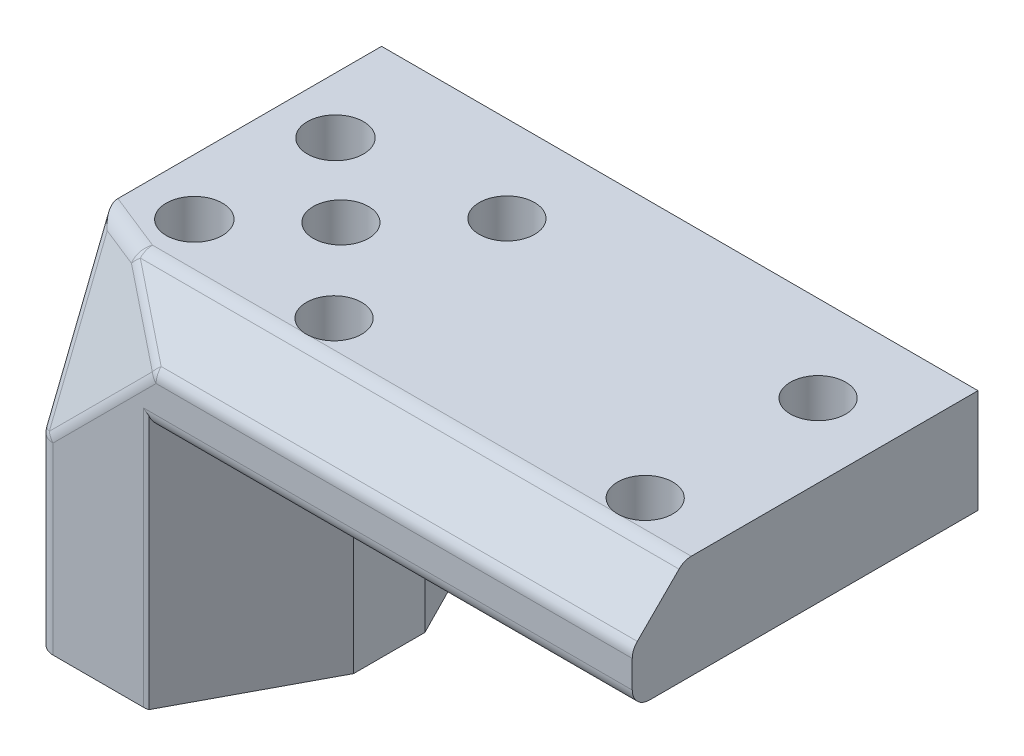
ISO-10303-21;
HEADER;
FILE_DESCRIPTION(('STEP AP214'),'2;1');
FILE_NAME('part.step','',(''),(''),'','','');
FILE_SCHEMA(('AUTOMOTIVE_DESIGN { 1 0 10303 214 1 1 1 1 }'));
ENDSEC;
DATA;
#1=APPLICATION_CONTEXT('core data for automotive mechanical design processes');
#2=APPLICATION_PROTOCOL_DEFINITION('international standard','automotive_design',2000,#1);
#3=PRODUCT_CONTEXT('',#1,'mechanical');
#4=PRODUCT('Part','Part','',(#3));
#5=PRODUCT_RELATED_PRODUCT_CATEGORY('part','',(#4));
#6=PRODUCT_DEFINITION_FORMATION('','',#4);
#7=PRODUCT_DEFINITION_CONTEXT('part definition',#1,'design');
#8=PRODUCT_DEFINITION('design','',#6,#7);
#9=PRODUCT_DEFINITION_SHAPE('','',#8);
#10=(LENGTH_UNIT() NAMED_UNIT(*) SI_UNIT(.MILLI.,.METRE.));
#11=(NAMED_UNIT(*) PLANE_ANGLE_UNIT() SI_UNIT($,.RADIAN.));
#12=(NAMED_UNIT(*) SI_UNIT($,.STERADIAN.) SOLID_ANGLE_UNIT());
#13=UNCERTAINTY_MEASURE_WITH_UNIT(LENGTH_MEASURE(1.E-05),#10,'distance_accuracy_value','');
#14=(GEOMETRIC_REPRESENTATION_CONTEXT(3) GLOBAL_UNCERTAINTY_ASSIGNED_CONTEXT((#13)) GLOBAL_UNIT_ASSIGNED_CONTEXT((#10,
#11,#12)) REPRESENTATION_CONTEXT('',''));
#15=CARTESIAN_POINT('',(0.,0.,0.));
#16=DIRECTION('',(0.,0.,1.));
#17=DIRECTION('',(1.,0.,0.));
#18=AXIS2_PLACEMENT_3D('',#15,#16,#17);
#19=CARTESIAN_POINT('',(0.,20.,0.));
#20=DIRECTION('',(0.,1.,0.));
#21=DIRECTION('',(0.,0.,1.));
#22=AXIS2_PLACEMENT_3D('',#19,#20,#21);
#23=PLANE('',#22);
#24=CARTESIAN_POINT('',(4.39754633131114,20.,0.));
#25=DIRECTION('',(0.,1.,0.));
#26=DIRECTION('',(0.,0.,1.));
#27=AXIS2_PLACEMENT_3D('',#24,#25,#26);
#28=CIRCLE('',#27,1.6);
#29=CARTESIAN_POINT('',(4.39754633131114,20.,1.59999999999997));
#30=VERTEX_POINT('',#29);
#31=EDGE_CURVE('E195',#30,#30,#28,.T.);
#32=ORIENTED_EDGE('',*,*,#31,.F.);
#33=EDGE_LOOP('',(#32));
#34=FACE_BOUND('',#33,.T.);
#35=CARTESIAN_POINT('',(27.,20.,-5.));
#36=DIRECTION('',(0.,1.,0.));
#37=DIRECTION('',(0.,0.,1.));
#38=AXIS2_PLACEMENT_3D('',#35,#36,#37);
#39=CIRCLE('',#38,1.60000000000001);
#40=CARTESIAN_POINT('',(27.,20.,-3.39999999999999));
#41=VERTEX_POINT('',#40);
#42=EDGE_CURVE('E203',#41,#41,#39,.T.);
#43=ORIENTED_EDGE('',*,*,#42,.F.);
#44=EDGE_LOOP('',(#43));
#45=FACE_BOUND('',#44,.T.);
#46=DIRECTION('',(0.,0.,1.));
#47=VECTOR('',#46,1.);
#48=CARTESIAN_POINT('',(-3.25,20.,-9.99999999999999));
#49=LINE('',#48,#47);
#50=CARTESIAN_POINT('',(-3.25,20.,-9.99999999999999));
#51=VERTEX_POINT('',#50);
#52=CARTESIAN_POINT('',(-3.24999999999999,20.,5.25108747069241));
#53=VERTEX_POINT('',#52);
#54=EDGE_CURVE('E241',#51,#53,#49,.T.);
#55=ORIENTED_EDGE('',*,*,#54,.T.);
#56=DIRECTION('',(0.928476690885259,0.,0.371390676354104));
#57=VECTOR('',#56,1.);
#58=CARTESIAN_POINT('',(-2.25899567954911,20.,5.64748919887276));
#59=LINE('',#58,#57);
#60=CARTESIAN_POINT('',(0.0867474173362875,20.,6.58578643762692));
#61=VERTEX_POINT('',#60);
#62=EDGE_CURVE('E320',#53,#61,#59,.T.);
#63=ORIENTED_EDGE('',*,*,#62,.T.);
#64=DIRECTION('',(1.,0.,0.));
#65=VECTOR('',#64,1.);
#66=CARTESIAN_POINT('',(0.,20.,6.58578643762692));
#67=LINE('',#66,#65);
#68=CARTESIAN_POINT('',(8.78720579369134,20.,6.58578643762692));
#69=VERTEX_POINT('',#68);
#70=EDGE_CURVE('E318',#61,#69,#67,.T.);
#71=ORIENTED_EDGE('',*,*,#70,.T.);
#72=CARTESIAN_POINT('',(9.,20.,5.));
#73=DIRECTION('',(0.,1.,0.));
#74=DIRECTION('',(0.,0.,1.));
#75=AXIS2_PLACEMENT_3D('',#72,#73,#74);
#76=CIRCLE('',#75,1.6);
#77=CARTESIAN_POINT('',(9.21279420630865,20.,6.58578643762692));
#78=VERTEX_POINT('',#77);
#79=EDGE_CURVE('E202',#78,#69,#76,.T.);
#80=ORIENTED_EDGE('',*,*,#79,.F.);
#81=DIRECTION('',(1.,0.,0.));
#82=VECTOR('',#81,1.);
#83=CARTESIAN_POINT('',(0.,20.,6.58578643762692));
#84=LINE('',#83,#82);
#85=CARTESIAN_POINT('',(26.7872057936913,20.,6.58578643762692));
#86=VERTEX_POINT('',#85);
#87=EDGE_CURVE('E316',#78,#86,#84,.T.);
#88=ORIENTED_EDGE('',*,*,#87,.T.);
#89=CARTESIAN_POINT('',(27.,20.,5.));
#90=DIRECTION('',(0.,1.,0.));
#91=DIRECTION('',(0.,0.,1.));
#92=AXIS2_PLACEMENT_3D('',#89,#90,#91);
#93=CIRCLE('',#92,1.60000000000001);
#94=CARTESIAN_POINT('',(27.2127942063087,20.,6.58578643762692));
#95=VERTEX_POINT('',#94);
#96=EDGE_CURVE('E199',#95,#86,#93,.T.);
#97=ORIENTED_EDGE('',*,*,#96,.F.);
#98=DIRECTION('',(1.,0.,0.));
#99=VECTOR('',#98,1.);
#100=CARTESIAN_POINT('',(0.,20.,6.58578643762692));
#101=LINE('',#100,#99);
#102=CARTESIAN_POINT('',(31.25,20.,6.58578643762692));
#103=VERTEX_POINT('',#102);
#104=EDGE_CURVE('E314',#95,#103,#101,.T.);
#105=ORIENTED_EDGE('',*,*,#104,.T.);
#106=DIRECTION('',(0.,0.,1.));
#107=VECTOR('',#106,1.);
#108=CARTESIAN_POINT('',(31.25,20.,10.));
#109=LINE('',#108,#107);
#110=CARTESIAN_POINT('',(31.25,20.,-9.99999999999999));
#111=VERTEX_POINT('',#110);
#112=EDGE_CURVE('E221',#111,#103,#109,.T.);
#113=ORIENTED_EDGE('',*,*,#112,.F.);
#114=DIRECTION('',(-1.,0.,0.));
#115=VECTOR('',#114,1.);
#116=CARTESIAN_POINT('',(-3.25,20.,-9.99999999999999));
#117=LINE('',#116,#115);
#118=EDGE_CURVE('E239',#111,#51,#117,.T.);
#119=ORIENTED_EDGE('',*,*,#118,.T.);
#120=EDGE_LOOP('',(#55,#63,#71,#80,#88,#97,#105,#113,#119));
#121=FACE_BOUND('',#120,.T.);
#122=CARTESIAN_POINT('',(8.99999999999999,20.,-5.));
#123=DIRECTION('',(0.,1.,0.));
#124=DIRECTION('',(0.,0.,1.));
#125=AXIS2_PLACEMENT_3D('',#122,#123,#124);
#126=CIRCLE('',#125,1.6);
#127=CARTESIAN_POINT('',(8.99999999999999,20.,-3.4));
#128=VERTEX_POINT('',#127);
#129=EDGE_CURVE('E206',#128,#128,#126,.T.);
#130=ORIENTED_EDGE('',*,*,#129,.F.);
#131=EDGE_LOOP('',(#130));
#132=FACE_BOUND('',#131,.T.);
#133=CARTESIAN_POINT('',(0.,20.,-4.08186063750002));
#134=DIRECTION('',(0.,1.,0.));
#135=DIRECTION('',(0.,0.,1.));
#136=AXIS2_PLACEMENT_3D('',#133,#134,#135);
#137=CIRCLE('',#136,1.625);
#138=CARTESIAN_POINT('',(0.,20.,-2.45686063750001));
#139=VERTEX_POINT('',#138);
#140=EDGE_CURVE('E228',#139,#139,#137,.T.);
#141=ORIENTED_EDGE('',*,*,#140,.F.);
#142=EDGE_LOOP('',(#141));
#143=FACE_BOUND('',#142,.T.);
#144=CARTESIAN_POINT('',(0.,20.,4.08186063750001));
#145=DIRECTION('',(0.,1.,0.));
#146=DIRECTION('',(0.,0.,1.));
#147=AXIS2_PLACEMENT_3D('',#144,#145,#146);
#148=CIRCLE('',#147,1.625);
#149=CARTESIAN_POINT('',(0.,20.,5.70686063750001));
#150=VERTEX_POINT('',#149);
#151=EDGE_CURVE('E234',#150,#150,#148,.T.);
#152=ORIENTED_EDGE('',*,*,#151,.F.);
#153=EDGE_LOOP('',(#152));
#154=FACE_BOUND('',#153,.T.);
#155=ADVANCED_FACE('F32',(#34,#45,#121,#132,#143,#154),#23,.T.);
#156=CARTESIAN_POINT('',(0.,0.,0.));
#157=DIRECTION('',(0.,1.,0.));
#158=DIRECTION('',(0.,0.,1.));
#159=AXIS2_PLACEMENT_3D('',#156,#157,#158);
#160=PLANE('',#159);
#161=CARTESIAN_POINT('',(0.,0.,4.08186063750001));
#162=DIRECTION('',(0.,1.,0.));
#163=DIRECTION('',(0.,0.,1.));
#164=AXIS2_PLACEMENT_3D('',#161,#162,#163);
#165=CIRCLE('',#164,1.625);
#166=CARTESIAN_POINT('',(0.,0.,5.70686063750001));
#167=VERTEX_POINT('',#166);
#168=EDGE_CURVE('E231',#167,#167,#165,.T.);
#169=ORIENTED_EDGE('',*,*,#168,.T.);
#170=EDGE_LOOP('',(#169));
#171=FACE_BOUND('',#170,.T.);
#172=CARTESIAN_POINT('',(0.,0.,-4.08186063750002));
#173=DIRECTION('',(0.,1.,0.));
#174=DIRECTION('',(0.,0.,1.));
#175=AXIS2_PLACEMENT_3D('',#172,#173,#174);
#176=CIRCLE('',#175,1.625);
#177=CARTESIAN_POINT('',(0.,0.,-2.45686063750001));
#178=VERTEX_POINT('',#177);
#179=EDGE_CURVE('E227',#178,#178,#176,.T.);
#180=ORIENTED_EDGE('',*,*,#179,.T.);
#181=EDGE_LOOP('',(#180));
#182=FACE_BOUND('',#181,.T.);
#183=DIRECTION('',(-0.470099456092972,0.,0.882613449580898));
#184=VECTOR('',#183,1.);
#185=CARTESIAN_POINT('',(7.36683500885674,0.,2.23557898195876));
#186=LINE('',#185,#184);
#187=CARTESIAN_POINT('',(7.36683500885674,0.,2.23557898195876));
#188=VERTEX_POINT('',#187);
#189=CARTESIAN_POINT('',(3.25000000000001,0.,9.9649517804753));
#190=VERTEX_POINT('',#189);
#191=EDGE_CURVE('E188',#188,#190,#186,.T.);
#192=ORIENTED_EDGE('',*,*,#191,.T.);
#193=CARTESIAN_POINT('',(2.98757275035255,0.,9.00000000000001));
#194=DIRECTION('',(0.,1.,0.));
#195=DIRECTION('',(0.,0.,1.));
#196=AXIS2_PLACEMENT_3D('',#193,#194,#195);
#197=CIRCLE('',#196,1.);
#198=CARTESIAN_POINT('',(2.98757275035255,0.,10.));
#199=VERTEX_POINT('',#198);
#200=EDGE_CURVE('E299',#190,#199,#197,.F.);
#201=ORIENTED_EDGE('',*,*,#200,.T.);
#202=DIRECTION('',(1.,0.,0.));
#203=VECTOR('',#202,1.);
#204=CARTESIAN_POINT('',(-3.24999999999999,0.,10.));
#205=LINE('',#204,#203);
#206=CARTESIAN_POINT('',(-2.24999999999999,0.,10.));
#207=VERTEX_POINT('',#206);
#208=EDGE_CURVE('E242',#207,#199,#205,.T.);
#209=ORIENTED_EDGE('',*,*,#208,.F.);
#210=CARTESIAN_POINT('',(-2.24999999999999,0.,9.00000000000001));
#211=DIRECTION('',(0.,1.,0.));
#212=DIRECTION('',(0.,0.,1.));
#213=AXIS2_PLACEMENT_3D('',#210,#211,#212);
#214=CIRCLE('',#213,1.);
#215=CARTESIAN_POINT('',(-3.24999999999999,0.,9.00000000000001));
#216=VERTEX_POINT('',#215);
#217=EDGE_CURVE('E297',#207,#216,#214,.F.);
#218=ORIENTED_EDGE('',*,*,#217,.T.);
#219=DIRECTION('',(0.,0.,1.));
#220=VECTOR('',#219,1.);
#221=CARTESIAN_POINT('',(-3.25,0.,-9.99999999999999));
#222=LINE('',#221,#220);
#223=CARTESIAN_POINT('',(-3.25,0.,-9.99999999999999));
#224=VERTEX_POINT('',#223);
#225=EDGE_CURVE('E247',#224,#216,#222,.T.);
#226=ORIENTED_EDGE('',*,*,#225,.F.);
#227=DIRECTION('',(-1.,0.,0.));
#228=VECTOR('',#227,1.);
#229=CARTESIAN_POINT('',(-3.25,0.,-9.99999999999999));
#230=LINE('',#229,#228);
#231=CARTESIAN_POINT('',(3.25,0.,-9.99999999999999));
#232=VERTEX_POINT('',#231);
#233=EDGE_CURVE('E174',#232,#224,#230,.T.);
#234=ORIENTED_EDGE('',*,*,#233,.F.);
#235=DIRECTION('',(0.452600945600763,0.,0.891713173638976));
#236=VECTOR('',#235,1.);
#237=CARTESIAN_POINT('',(3.25,0.,-9.99999999999999));
#238=LINE('',#237,#236);
#239=CARTESIAN_POINT('',(7.36683500885674,0.,-1.88902266604213));
#240=VERTEX_POINT('',#239);
#241=EDGE_CURVE('E166',#232,#240,#238,.T.);
#242=ORIENTED_EDGE('',*,*,#241,.T.);
#243=DIRECTION('',(0.,0.,1.));
#244=VECTOR('',#243,1.);
#245=CARTESIAN_POINT('',(7.36683500885674,0.,-1.88902266604213));
#246=LINE('',#245,#244);
#247=EDGE_CURVE('E171',#240,#188,#246,.T.);
#248=ORIENTED_EDGE('',*,*,#247,.T.);
#249=EDGE_LOOP('',(#192,#201,#209,#218,#226,#234,#242,#248));
#250=FACE_BOUND('',#249,.T.);
#251=CARTESIAN_POINT('',(4.39754633131114,0.,0.));
#252=DIRECTION('',(0.,1.,0.));
#253=DIRECTION('',(0.,0.,1.));
#254=AXIS2_PLACEMENT_3D('',#251,#252,#253);
#255=CIRCLE('',#254,1.6);
#256=CARTESIAN_POINT('',(4.39754633131114,0.,1.59999999999997));
#257=VERTEX_POINT('',#256);
#258=EDGE_CURVE('E178',#257,#257,#255,.F.);
#259=ORIENTED_EDGE('',*,*,#258,.F.);
#260=EDGE_LOOP('',(#259));
#261=FACE_BOUND('',#260,.T.);
#262=ADVANCED_FACE('F169',(#171,#182,#250,#261),#160,.F.);
#263=CARTESIAN_POINT('',(-3.25,20.,-9.99999999999999));
#264=DIRECTION('',(0.,0.,1.));
#265=DIRECTION('',(1.,0.,0.));
#266=AXIS2_PLACEMENT_3D('',#263,#264,#265);
#267=PLANE('',#266);
#268=DIRECTION('',(-1.,0.,0.));
#269=VECTOR('',#268,1.);
#270=CARTESIAN_POINT('',(31.25,14.,-9.99999999999999));
#271=LINE('',#270,#269);
#272=CARTESIAN_POINT('',(31.25,14.,-9.99999999999999));
#273=VERTEX_POINT('',#272);
#274=CARTESIAN_POINT('',(3.25,14.,-9.99999999999999));
#275=VERTEX_POINT('',#274);
#276=EDGE_CURVE('E224',#273,#275,#271,.T.);
#277=ORIENTED_EDGE('',*,*,#276,.T.);
#278=DIRECTION('',(0.,-1.,0.));
#279=VECTOR('',#278,1.);
#280=CARTESIAN_POINT('',(3.25,20.,-9.99999999999999));
#281=LINE('',#280,#279);
#282=EDGE_CURVE('E254',#275,#232,#281,.T.);
#283=ORIENTED_EDGE('',*,*,#282,.T.);
#284=ORIENTED_EDGE('',*,*,#233,.T.);
#285=DIRECTION('',(0.,-1.,0.));
#286=VECTOR('',#285,1.);
#287=CARTESIAN_POINT('',(-3.25,20.,-9.99999999999999));
#288=LINE('',#287,#286);
#289=EDGE_CURVE('E245',#51,#224,#288,.T.);
#290=ORIENTED_EDGE('',*,*,#289,.F.);
#291=ORIENTED_EDGE('',*,*,#118,.F.);
#292=DIRECTION('',(0.,1.,0.));
#293=VECTOR('',#292,1.);
#294=CARTESIAN_POINT('',(31.25,20.,-9.99999999999999));
#295=LINE('',#294,#293);
#296=EDGE_CURVE('E218',#273,#111,#295,.T.);
#297=ORIENTED_EDGE('',*,*,#296,.F.);
#298=EDGE_LOOP('',(#277,#283,#284,#290,#291,#297));
#299=FACE_BOUND('',#298,.T.);
#300=ADVANCED_FACE('F368',(#299),#267,.F.);
#301=CARTESIAN_POINT('',(-3.25,20.,-9.99999999999999));
#302=DIRECTION('',(1.,0.,0.));
#303=DIRECTION('',(0.,0.,-1.));
#304=AXIS2_PLACEMENT_3D('',#301,#302,#303);
#305=PLANE('',#304);
#306=ORIENTED_EDGE('',*,*,#225,.T.);
#307=DIRECTION('',(0.,-1.,0.));
#308=VECTOR('',#307,1.);
#309=CARTESIAN_POINT('',(-3.24999999999999,20.,9.00000000000001));
#310=LINE('',#309,#308);
#311=CARTESIAN_POINT('',(-3.24999999999999,10.627718676731,9.00000000000001));
#312=VERTEX_POINT('',#311);
#313=EDGE_CURVE('E303',#216,#312,#310,.F.);
#314=ORIENTED_EDGE('',*,*,#313,.T.);
#315=DIRECTION('',(0.,-0.928476690885259,0.371390676354104));
#316=VECTOR('',#315,1.);
#317=CARTESIAN_POINT('',(-3.24999999999999,19.7417543002388,5.3543857505969));
#318=LINE('',#317,#316);
#319=EDGE_CURVE('E301',#312,#53,#318,.F.);
#320=ORIENTED_EDGE('',*,*,#319,.T.);
#321=ORIENTED_EDGE('',*,*,#54,.F.);
#322=ORIENTED_EDGE('',*,*,#289,.T.);
#323=EDGE_LOOP('',(#306,#314,#320,#321,#322));
#324=FACE_BOUND('',#323,.T.);
#325=ADVANCED_FACE('F372',(#324),#305,.F.);
#326=CARTESIAN_POINT('',(-3.24999999999999,20.,10.));
#327=DIRECTION('',(0.,0.,-1.));
#328=DIRECTION('',(-1.,0.,0.));
#329=AXIS2_PLACEMENT_3D('',#326,#327,#328);
#330=PLANE('',#329);
#331=DIRECTION('',(0.,1.,0.));
#332=VECTOR('',#331,1.);
#333=CARTESIAN_POINT('',(2.98757275035255,20.,10.));
#334=LINE('',#333,#332);
#335=CARTESIAN_POINT('',(2.98757275035255,15.,10.));
#336=VERTEX_POINT('',#335);
#337=EDGE_CURVE('E287',#199,#336,#334,.T.);
#338=ORIENTED_EDGE('',*,*,#337,.T.);
#339=DIRECTION('',(-1.,0.,0.));
#340=VECTOR('',#339,1.);
#341=CARTESIAN_POINT('',(-3.24999999999999,15.,10.));
#342=LINE('',#341,#340);
#343=CARTESIAN_POINT('',(31.25,15.,10.));
#344=VERTEX_POINT('',#343);
#345=EDGE_CURVE('E289',#336,#344,#342,.F.);
#346=ORIENTED_EDGE('',*,*,#345,.T.);
#347=DIRECTION('',(0.,-1.,0.));
#348=VECTOR('',#347,1.);
#349=CARTESIAN_POINT('',(31.25,20.,10.));
#350=LINE('',#349,#348);
#351=CARTESIAN_POINT('',(31.25,16.5857864376269,10.));
#352=VERTEX_POINT('',#351);
#353=EDGE_CURVE('E212',#352,#344,#350,.T.);
#354=ORIENTED_EDGE('',*,*,#353,.F.);
#355=DIRECTION('',(-1.,0.,0.));
#356=VECTOR('',#355,1.);
#357=CARTESIAN_POINT('',(3.75,16.5857864376269,10.));
#358=LINE('',#357,#356);
#359=CARTESIAN_POINT('',(3.70806776089592,16.5857864376269,10.));
#360=VERTEX_POINT('',#359);
#361=EDGE_CURVE('E282',#352,#360,#358,.T.);
#362=ORIENTED_EDGE('',*,*,#361,.T.);
#363=DIRECTION('',(0.707106781186547,0.707106781186548,0.));
#364=VECTOR('',#363,1.);
#365=CARTESIAN_POINT('',(-3.06385933836548,9.81385933836549,10.));
#366=LINE('',#365,#364);
#367=CARTESIAN_POINT('',(-2.24999999999999,10.627718676731,10.));
#368=VERTEX_POINT('',#367);
#369=EDGE_CURVE('E280',#360,#368,#366,.F.);
#370=ORIENTED_EDGE('',*,*,#369,.T.);
#371=DIRECTION('',(0.,-1.,0.));
#372=VECTOR('',#371,1.);
#373=CARTESIAN_POINT('',(-2.24999999999999,20.,10.));
#374=LINE('',#373,#372);
#375=EDGE_CURVE('E284',#368,#207,#374,.T.);
#376=ORIENTED_EDGE('',*,*,#375,.T.);
#377=ORIENTED_EDGE('',*,*,#208,.T.);
#378=EDGE_LOOP('',(#338,#346,#354,#362,#370,#376,#377));
#379=FACE_BOUND('',#378,.T.);
#380=ADVANCED_FACE('F361',(#379),#330,.F.);
#381=CARTESIAN_POINT('',(0.,20.,4.08186063750001));
#382=DIRECTION('',(0.,-1.,0.));
#383=DIRECTION('',(0.,0.,-1.));
#384=AXIS2_PLACEMENT_3D('',#381,#382,#383);
#385=CYLINDRICAL_SURFACE('',#384,1.625);
#386=ORIENTED_EDGE('',*,*,#151,.T.);
#387=EDGE_LOOP('',(#386));
#388=FACE_BOUND('',#387,.T.);
#389=ORIENTED_EDGE('',*,*,#168,.F.);
#390=EDGE_LOOP('',(#389));
#391=FACE_BOUND('',#390,.T.);
#392=ADVANCED_FACE('F357',(#388,#391),#385,.F.);
#393=CARTESIAN_POINT('',(0.,20.,-4.08186063750002));
#394=DIRECTION('',(0.,-1.,0.));
#395=DIRECTION('',(0.,0.,-1.));
#396=AXIS2_PLACEMENT_3D('',#393,#394,#395);
#397=CYLINDRICAL_SURFACE('',#396,1.625);
#398=ORIENTED_EDGE('',*,*,#140,.T.);
#399=EDGE_LOOP('',(#398));
#400=FACE_BOUND('',#399,.T.);
#401=ORIENTED_EDGE('',*,*,#179,.F.);
#402=EDGE_LOOP('',(#401));
#403=FACE_BOUND('',#402,.T.);
#404=ADVANCED_FACE('F353',(#400,#403),#397,.F.);
#405=CARTESIAN_POINT('',(31.25,14.,10.));
#406=DIRECTION('',(0.,1.,0.));
#407=DIRECTION('',(0.,0.,1.));
#408=AXIS2_PLACEMENT_3D('',#405,#406,#407);
#409=PLANE('',#408);
#410=CARTESIAN_POINT('',(27.,14.,-5.));
#411=DIRECTION('',(0.,1.,0.));
#412=DIRECTION('',(0.,0.,1.));
#413=AXIS2_PLACEMENT_3D('',#410,#411,#412);
#414=CIRCLE('',#413,1.60000000000001);
#415=CARTESIAN_POINT('',(27.,14.,-3.39999999999999));
#416=VERTEX_POINT('',#415);
#417=EDGE_CURVE('E216',#416,#416,#414,.T.);
#418=ORIENTED_EDGE('',*,*,#417,.T.);
#419=EDGE_LOOP('',(#418));
#420=FACE_BOUND('',#419,.T.);
#421=CARTESIAN_POINT('',(9.,14.,5.));
#422=DIRECTION('',(0.,1.,0.));
#423=DIRECTION('',(0.,0.,1.));
#424=AXIS2_PLACEMENT_3D('',#421,#422,#423);
#425=CIRCLE('',#424,1.6);
#426=CARTESIAN_POINT('',(9.,14.,6.6));
#427=VERTEX_POINT('',#426);
#428=EDGE_CURVE('E261',#427,#427,#425,.T.);
#429=ORIENTED_EDGE('',*,*,#428,.T.);
#430=EDGE_LOOP('',(#429));
#431=FACE_BOUND('',#430,.T.);
#432=CARTESIAN_POINT('',(27.,14.,5.));
#433=DIRECTION('',(0.,1.,0.));
#434=DIRECTION('',(0.,0.,1.));
#435=AXIS2_PLACEMENT_3D('',#432,#433,#434);
#436=CIRCLE('',#435,1.60000000000001);
#437=CARTESIAN_POINT('',(27.,14.,6.60000000000001));
#438=VERTEX_POINT('',#437);
#439=EDGE_CURVE('E258',#438,#438,#436,.T.);
#440=ORIENTED_EDGE('',*,*,#439,.T.);
#441=EDGE_LOOP('',(#440));
#442=FACE_BOUND('',#441,.T.);
#443=CARTESIAN_POINT('',(8.99999999999999,14.,-5.));
#444=DIRECTION('',(0.,1.,0.));
#445=DIRECTION('',(0.,0.,1.));
#446=AXIS2_PLACEMENT_3D('',#443,#444,#445);
#447=CIRCLE('',#446,1.6);
#448=CARTESIAN_POINT('',(8.99999999999999,14.,-3.4));
#449=VERTEX_POINT('',#448);
#450=EDGE_CURVE('E211',#449,#449,#447,.T.);
#451=ORIENTED_EDGE('',*,*,#450,.T.);
#452=EDGE_LOOP('',(#451));
#453=FACE_BOUND('',#452,.T.);
#454=DIRECTION('',(0.,0.,-1.));
#455=VECTOR('',#454,1.);
#456=CARTESIAN_POINT('',(31.25,14.,10.));
#457=LINE('',#456,#455);
#458=CARTESIAN_POINT('',(31.25,14.,9.00000000000001));
#459=VERTEX_POINT('',#458);
#460=EDGE_CURVE('E215',#459,#273,#457,.T.);
#461=ORIENTED_EDGE('',*,*,#460,.F.);
#462=DIRECTION('',(-1.,0.,0.));
#463=VECTOR('',#462,1.);
#464=CARTESIAN_POINT('',(31.25,14.,9.00000000000001));
#465=LINE('',#464,#463);
#466=CARTESIAN_POINT('',(3.76395467333155,14.,9.00000000000002));
#467=VERTEX_POINT('',#466);
#468=EDGE_CURVE('E277',#459,#467,#465,.T.);
#469=ORIENTED_EDGE('',*,*,#468,.T.);
#470=DIRECTION('',(0.470099456092972,0.,-0.882613449580898));
#471=VECTOR('',#470,1.);
#472=CARTESIAN_POINT('',(9.42327589068159,14.,-1.62539630112613));
#473=LINE('',#472,#471);
#474=CARTESIAN_POINT('',(7.36683500885675,14.,2.23557898195876));
#475=VERTEX_POINT('',#474);
#476=EDGE_CURVE('E269',#467,#475,#473,.T.);
#477=ORIENTED_EDGE('',*,*,#476,.T.);
#478=DIRECTION('',(0.,0.,-1.));
#479=VECTOR('',#478,1.);
#480=CARTESIAN_POINT('',(7.36683500885675,14.,10.));
#481=LINE('',#480,#479);
#482=CARTESIAN_POINT('',(7.36683500885674,14.,-1.88902266604213));
#483=VERTEX_POINT('',#482);
#484=EDGE_CURVE('E267',#475,#483,#481,.T.);
#485=ORIENTED_EDGE('',*,*,#484,.T.);
#486=DIRECTION('',(-0.452600945600763,0.,-0.891713173638976));
#487=VECTOR('',#486,1.);
#488=CARTESIAN_POINT('',(17.0575377587169,14.,17.2035739974483));
#489=LINE('',#488,#487);
#490=EDGE_CURVE('E192',#483,#275,#489,.T.);
#491=ORIENTED_EDGE('',*,*,#490,.T.);
#492=ORIENTED_EDGE('',*,*,#276,.F.);
#493=EDGE_LOOP('',(#461,#469,#477,#485,#491,#492));
#494=FACE_BOUND('',#493,.T.);
#495=ADVANCED_FACE('F349',(#420,#431,#442,#453,#494),#409,.F.);
#496=CARTESIAN_POINT('',(31.25,0.,0.));
#497=DIRECTION('',(1.,0.,0.));
#498=DIRECTION('',(0.,0.,-1.));
#499=AXIS2_PLACEMENT_3D('',#496,#497,#498);
#500=PLANE('',#499);
#501=ORIENTED_EDGE('',*,*,#353,.T.);
#502=CARTESIAN_POINT('',(31.25,15.,9.00000000000001));
#503=DIRECTION('',(1.,0.,0.));
#504=DIRECTION('',(0.,0.,-1.));
#505=AXIS2_PLACEMENT_3D('',#502,#503,#504);
#506=CIRCLE('',#505,1.);
#507=EDGE_CURVE('E295',#344,#459,#506,.T.);
#508=ORIENTED_EDGE('',*,*,#507,.T.);
#509=ORIENTED_EDGE('',*,*,#460,.T.);
#510=ORIENTED_EDGE('',*,*,#296,.T.);
#511=ORIENTED_EDGE('',*,*,#112,.T.);
#512=CARTESIAN_POINT('',(31.25,19.,6.58578643762692));
#513=DIRECTION('',(1.,0.,0.));
#514=DIRECTION('',(0.,0.,-1.));
#515=AXIS2_PLACEMENT_3D('',#512,#513,#514);
#516=CIRCLE('',#515,1.);
#517=CARTESIAN_POINT('',(31.25,19.7071067811865,7.29289321881347));
#518=VERTEX_POINT('',#517);
#519=EDGE_CURVE('E293',#103,#518,#516,.T.);
#520=ORIENTED_EDGE('',*,*,#519,.T.);
#521=DIRECTION('',(0.,-0.707106781186549,0.707106781186546));
#522=VECTOR('',#521,1.);
#523=CARTESIAN_POINT('',(31.25,13.5,13.5));
#524=LINE('',#523,#522);
#525=CARTESIAN_POINT('',(31.25,17.2928932188134,9.70710678118656));
#526=VERTEX_POINT('',#525);
#527=EDGE_CURVE('E271',#518,#526,#524,.T.);
#528=ORIENTED_EDGE('',*,*,#527,.T.);
#529=CARTESIAN_POINT('',(31.25,16.5857864376269,9.00000000000001));
#530=DIRECTION('',(1.,0.,0.));
#531=DIRECTION('',(0.,0.,-1.));
#532=AXIS2_PLACEMENT_3D('',#529,#530,#531);
#533=CIRCLE('',#532,1.);
#534=EDGE_CURVE('E291',#526,#352,#533,.T.);
#535=ORIENTED_EDGE('',*,*,#534,.T.);
#536=EDGE_LOOP('',(#501,#508,#509,#510,#511,#520,#528,#535));
#537=FACE_BOUND('',#536,.T.);
#538=ADVANCED_FACE('F345',(#537),#500,.T.);
#539=CARTESIAN_POINT('',(8.99999999999999,-10.,-5.));
#540=DIRECTION('',(0.,1.,0.));
#541=DIRECTION('',(0.,0.,1.));
#542=AXIS2_PLACEMENT_3D('',#539,#540,#541);
#543=CYLINDRICAL_SURFACE('',#542,1.6);
#544=ORIENTED_EDGE('',*,*,#129,.T.);
#545=EDGE_LOOP('',(#544));
#546=FACE_BOUND('',#545,.T.);
#547=ORIENTED_EDGE('',*,*,#450,.F.);
#548=EDGE_LOOP('',(#547));
#549=FACE_BOUND('',#548,.T.);
#550=ADVANCED_FACE('F342',(#546,#549),#543,.F.);
#551=CARTESIAN_POINT('',(27.,-10.,5.));
#552=DIRECTION('',(0.,1.,0.));
#553=DIRECTION('',(0.,0.,1.));
#554=AXIS2_PLACEMENT_3D('',#551,#552,#553);
#555=CYLINDRICAL_SURFACE('',#554,1.60000000000001);
#556=ORIENTED_EDGE('',*,*,#96,.T.);
#557=CARTESIAN_POINT('',(26.7872057936913,20.,6.58578643762692));
#558=CARTESIAN_POINT('',(26.8581371957942,19.999932654814,6.59526214587564));
#559=CARTESIAN_POINT('',(26.9290685978971,19.9998989822211,6.60000000000001));
#560=CARTESIAN_POINT('',(27.0709314021029,19.9998989822211,6.60000000000001));
#561=CARTESIAN_POINT('',(27.1418628042058,19.999932654814,6.59526214587564));
#562=CARTESIAN_POINT('',(27.2127942063087,20.,6.58578643762692));
#563=B_SPLINE_CURVE_WITH_KNOTS('',3,(#557,#558,#559,#560,#561,#562),.UNSPECIFIED.,.F.,.F.,(4,2,
4),(0.,0.213268398499342,0.426536796998684),.UNSPECIFIED.);
#564=EDGE_CURVE('E328',#86,#95,#563,.T.);
#565=ORIENTED_EDGE('',*,*,#564,.T.);
#566=EDGE_LOOP('',(#556,#565));
#567=FACE_BOUND('',#566,.T.);
#568=ORIENTED_EDGE('',*,*,#439,.F.);
#569=EDGE_LOOP('',(#568));
#570=FACE_BOUND('',#569,.T.);
#571=ADVANCED_FACE('F340',(#567,#570),#555,.F.);
#572=CARTESIAN_POINT('',(9.,-10.,5.));
#573=DIRECTION('',(0.,1.,0.));
#574=DIRECTION('',(0.,0.,1.));
#575=AXIS2_PLACEMENT_3D('',#572,#573,#574);
#576=CYLINDRICAL_SURFACE('',#575,1.6);
#577=ORIENTED_EDGE('',*,*,#79,.T.);
#578=CARTESIAN_POINT('',(8.78720579369134,20.,6.58578643762692));
#579=CARTESIAN_POINT('',(8.85813719579422,19.999932654814,6.59526214587564));
#580=CARTESIAN_POINT('',(8.92906859789711,19.9998989822211,6.6));
#581=CARTESIAN_POINT('',(9.07093140210288,19.9998989822211,6.6));
#582=CARTESIAN_POINT('',(9.14186280420577,19.999932654814,6.59526214587564));
#583=CARTESIAN_POINT('',(9.21279420630865,20.,6.58578643762692));
#584=B_SPLINE_CURVE_WITH_KNOTS('',3,(#578,#579,#580,#581,#582,#583),.UNSPECIFIED.,.F.,.F.,(4,2,
4),(0.,0.213268398499302,0.426536796998603),.UNSPECIFIED.);
#585=EDGE_CURVE('E322',#69,#78,#584,.T.);
#586=ORIENTED_EDGE('',*,*,#585,.T.);
#587=EDGE_LOOP('',(#577,#586));
#588=FACE_BOUND('',#587,.T.);
#589=ORIENTED_EDGE('',*,*,#428,.F.);
#590=EDGE_LOOP('',(#589));
#591=FACE_BOUND('',#590,.T.);
#592=ADVANCED_FACE('F334',(#588,#591),#576,.F.);
#593=CARTESIAN_POINT('',(27.,-10.,-5.));
#594=DIRECTION('',(0.,1.,0.));
#595=DIRECTION('',(0.,0.,1.));
#596=AXIS2_PLACEMENT_3D('',#593,#594,#595);
#597=CYLINDRICAL_SURFACE('',#596,1.60000000000001);
#598=ORIENTED_EDGE('',*,*,#42,.T.);
#599=EDGE_LOOP('',(#598));
#600=FACE_BOUND('',#599,.T.);
#601=ORIENTED_EDGE('',*,*,#417,.F.);
#602=EDGE_LOOP('',(#601));
#603=FACE_BOUND('',#602,.T.);
#604=ADVANCED_FACE('F339',(#600,#603),#597,.F.);
#605=CARTESIAN_POINT('',(7.36683500885674,-22.6432591648218,2.23557898195876));
#606=DIRECTION('',(0.882613449580897,0.,0.470099456092972));
#607=DIRECTION('',(0.470099456092972,0.,-0.882613449580898));
#608=AXIS2_PLACEMENT_3D('',#605,#606,#607);
#609=PLANE('',#608);
#610=DIRECTION('',(0.,1.,0.));
#611=VECTOR('',#610,1.);
#612=CARTESIAN_POINT('',(3.25,20.,9.96495178047533));
#613=LINE('',#612,#611);
#614=CARTESIAN_POINT('',(3.25,14.7375727503525,9.96495178047533));
#615=VERTEX_POINT('',#614);
#616=EDGE_CURVE('E50',#190,#615,#613,.T.);
#617=ORIENTED_EDGE('',*,*,#616,.F.);
#618=ORIENTED_EDGE('',*,*,#191,.F.);
#619=DIRECTION('',(0.,1.,0.));
#620=VECTOR('',#619,1.);
#621=CARTESIAN_POINT('',(7.36683500885674,-22.6432591648218,2.23557898195876));
#622=LINE('',#621,#620);
#623=EDGE_CURVE('E187',#188,#475,#622,.T.);
#624=ORIENTED_EDGE('',*,*,#623,.T.);
#625=ORIENTED_EDGE('',*,*,#476,.F.);
#626=CARTESIAN_POINT('',(3.76395467333156,15.,9.00000000000001));
#627=DIRECTION('',(0.882613449580897,0.,0.470099456092972));
#628=DIRECTION('',(-0.470099456092972,0.,0.882613449580898));
#629=AXIS2_PLACEMENT_3D('',#626,#627,#628);
#630=ELLIPSE('',#629,1.13299882352217,1.);
#631=EDGE_CURVE('E11',#467,#615,#630,.F.);
#632=ORIENTED_EDGE('',*,*,#631,.T.);
#633=EDGE_LOOP('',(#617,#618,#624,#625,#632));
#634=FACE_BOUND('',#633,.T.);
#635=ADVANCED_FACE('F506',(#634),#609,.T.);
#636=CARTESIAN_POINT('',(7.36683500885674,-22.6432591648218,-1.88902266604213));
#637=DIRECTION('',(1.,0.,0.));
#638=DIRECTION('',(0.,0.,-1.));
#639=AXIS2_PLACEMENT_3D('',#636,#637,#638);
#640=PLANE('',#639);
#641=ORIENTED_EDGE('',*,*,#484,.F.);
#642=ORIENTED_EDGE('',*,*,#623,.F.);
#643=ORIENTED_EDGE('',*,*,#247,.F.);
#644=DIRECTION('',(0.,1.,0.));
#645=VECTOR('',#644,1.);
#646=CARTESIAN_POINT('',(7.36683500885674,-22.6432591648218,-1.88902266604213));
#647=LINE('',#646,#645);
#648=EDGE_CURVE('E185',#240,#483,#647,.T.);
#649=ORIENTED_EDGE('',*,*,#648,.T.);
#650=EDGE_LOOP('',(#641,#642,#643,#649));
#651=FACE_BOUND('',#650,.T.);
#652=ADVANCED_FACE('F184',(#651),#640,.T.);
#653=CARTESIAN_POINT('',(3.25,-22.6432591648218,-9.99999999999999));
#654=DIRECTION('',(0.891713173638976,0.,-0.452600945600763));
#655=DIRECTION('',(-0.452600945600763,0.,-0.891713173638976));
#656=AXIS2_PLACEMENT_3D('',#653,#654,#655);
#657=PLANE('',#656);
#658=ORIENTED_EDGE('',*,*,#490,.F.);
#659=ORIENTED_EDGE('',*,*,#648,.F.);
#660=ORIENTED_EDGE('',*,*,#241,.F.);
#661=ORIENTED_EDGE('',*,*,#282,.F.);
#662=EDGE_LOOP('',(#658,#659,#660,#661));
#663=FACE_BOUND('',#662,.T.);
#664=ADVANCED_FACE('F191',(#663),#657,.T.);
#665=CARTESIAN_POINT('',(4.39754633131114,-22.6432591648218,0.));
#666=DIRECTION('',(0.,1.,0.));
#667=DIRECTION('',(0.,0.,1.));
#668=AXIS2_PLACEMENT_3D('',#665,#666,#667);
#669=CYLINDRICAL_SURFACE('',#668,1.6);
#670=ORIENTED_EDGE('',*,*,#31,.T.);
#671=EDGE_LOOP('',(#670));
#672=FACE_BOUND('',#671,.T.);
#673=ORIENTED_EDGE('',*,*,#258,.T.);
#674=EDGE_LOOP('',(#673));
#675=FACE_BOUND('',#674,.T.);
#676=ADVANCED_FACE('F559',(#672,#675),#669,.F.);
#677=CARTESIAN_POINT('',(-4.63636363636364,4.63636363636364,11.5909090909091));
#678=DIRECTION('',(-0.348155311911396,0.348155311911396,0.870388279778489));
#679=DIRECTION('',(0.928476690885259,0.,0.371390676354104));
#680=AXIS2_PLACEMENT_3D('',#677,#678,#679);
#681=PLANE('',#680);
#682=DIRECTION('',(0.92847669088526,0.,0.371390676354104));
#683=VECTOR('',#682,1.);
#684=CARTESIAN_POINT('',(-2.6071509914605,19.3481553119114,6.51787747865125));
#685=LINE('',#684,#683);
#686=CARTESIAN_POINT('',(-0.261407894575109,19.3481553119114,7.45617471740541));
#687=VERTEX_POINT('',#686);
#688=CARTESIAN_POINT('',(-2.59815531191139,19.3481553119114,6.5214757504709));
#689=VERTEX_POINT('',#688);
#690=EDGE_CURVE('E309',#687,#689,#685,.F.);
#691=ORIENTED_EDGE('',*,*,#690,.T.);
#692=DIRECTION('',(0.,-0.928476690885259,0.371390676354104));
#693=VECTOR('',#692,1.);
#694=CARTESIAN_POINT('',(-2.59815531191139,10.0899096121501,10.2247740303754));
#695=LINE('',#694,#693);
#696=CARTESIAN_POINT('',(-2.59815531191139,10.9758739886424,9.8703882797785));
#697=VERTEX_POINT('',#696);
#698=EDGE_CURVE('E311',#689,#697,#695,.T.);
#699=ORIENTED_EDGE('',*,*,#698,.T.);
#700=DIRECTION('',(0.707106781186547,0.707106781186548,0.));
#701=VECTOR('',#700,1.);
#702=CARTESIAN_POINT('',(3.58798534972311,17.1620146502769,9.8703882797785));
#703=LINE('',#702,#701);
#704=CARTESIAN_POINT('',(3.35991244898453,16.9339417495383,9.8703882797785));
#705=VERTEX_POINT('',#704);
#706=EDGE_CURVE('E305',#697,#705,#703,.T.);
#707=ORIENTED_EDGE('',*,*,#706,.T.);
#708=DIRECTION('',(-0.727606875108997,0.485071250072668,-0.485071250072666));
#709=VECTOR('',#708,1.);
#710=CARTESIAN_POINT('',(4.07415414179032,16.4577806210011,10.3465494083157));
#711=LINE('',#710,#709);
#712=EDGE_CURVE('E307',#705,#687,#711,.T.);
#713=ORIENTED_EDGE('',*,*,#712,.T.);
#714=EDGE_LOOP('',(#691,#699,#707,#713));
#715=FACE_BOUND('',#714,.T.);
#716=ADVANCED_FACE('F384',(#715),#681,.T.);
#717=CARTESIAN_POINT('',(0.,20.,7.00000000000001));
#718=DIRECTION('',(0.,0.707106781186546,0.707106781186549));
#719=DIRECTION('',(-1.,0.,0.));
#720=AXIS2_PLACEMENT_3D('',#717,#718,#719);
#721=PLANE('',#720);
#722=ORIENTED_EDGE('',*,*,#527,.F.);
#723=DIRECTION('',(1.,0.,0.));
#724=VECTOR('',#723,1.);
#725=CARTESIAN_POINT('',(0.,19.7071067811865,7.29289321881347));
#726=LINE('',#725,#724);
#727=CARTESIAN_POINT('',(0.0867474173362854,19.7071067811865,7.29289321881347));
#728=VERTEX_POINT('',#727);
#729=EDGE_CURVE('E42',#518,#728,#726,.F.);
#730=ORIENTED_EDGE('',*,*,#729,.T.);
#731=DIRECTION('',(-0.727606875108997,0.485071250072668,-0.485071250072666));
#732=VECTOR('',#731,1.);
#733=CARTESIAN_POINT('',(-0.165925840415951,19.875555619688,7.12444438031198));
#734=LINE('',#733,#732);
#735=CARTESIAN_POINT('',(3.70806776089592,17.2928932188134,9.70710678118656));
#736=VERTEX_POINT('',#735);
#737=EDGE_CURVE('E450',#728,#736,#734,.F.);
#738=ORIENTED_EDGE('',*,*,#737,.T.);
#739=DIRECTION('',(-1.,0.,0.));
#740=VECTOR('',#739,1.);
#741=CARTESIAN_POINT('',(31.25,17.2928932188134,9.70710678118656));
#742=LINE('',#741,#740);
#743=EDGE_CURVE('E471',#736,#526,#742,.F.);
#744=ORIENTED_EDGE('',*,*,#743,.T.);
#745=EDGE_LOOP('',(#722,#730,#738,#744));
#746=FACE_BOUND('',#745,.T.);
#747=ADVANCED_FACE('F380',(#746),#721,.T.);
#748=CARTESIAN_POINT('',(2.98757275035255,20.,9.00000000000001));
#749=DIRECTION('',(0.,1.,0.));
#750=DIRECTION('',(0.,0.,1.));
#751=AXIS2_PLACEMENT_3D('',#748,#749,#750);
#752=CYLINDRICAL_SURFACE('',#751,1.);
#753=ORIENTED_EDGE('',*,*,#616,.T.);
#754=CARTESIAN_POINT('',(2.98757275035255,15.,9.00000000000001));
#755=DIRECTION('',(-0.707106781186548,-0.707106781186547,0.));
#756=DIRECTION('',(-0.707106781186548,0.707106781186547,0.));
#757=AXIS2_PLACEMENT_3D('',#754,#755,#756);
#758=ELLIPSE('',#757,1.41421356237309,1.);
#759=EDGE_CURVE('E274',#336,#615,#758,.F.);
#760=ORIENTED_EDGE('',*,*,#759,.F.);
#761=ORIENTED_EDGE('',*,*,#337,.F.);
#762=ORIENTED_EDGE('',*,*,#200,.F.);
#763=EDGE_LOOP('',(#753,#760,#761,#762));
#764=FACE_BOUND('',#763,.T.);
#765=ADVANCED_FACE('F383',(#764),#752,.T.);
#766=CARTESIAN_POINT('',(31.25,15.,9.00000000000001));
#767=DIRECTION('',(-1.,0.,0.));
#768=DIRECTION('',(0.,0.,1.));
#769=AXIS2_PLACEMENT_3D('',#766,#767,#768);
#770=CYLINDRICAL_SURFACE('',#769,1.);
#771=ORIENTED_EDGE('',*,*,#507,.F.);
#772=ORIENTED_EDGE('',*,*,#345,.F.);
#773=ORIENTED_EDGE('',*,*,#759,.T.);
#774=ORIENTED_EDGE('',*,*,#631,.F.);
#775=ORIENTED_EDGE('',*,*,#468,.F.);
#776=EDGE_LOOP('',(#771,#772,#773,#774,#775));
#777=FACE_BOUND('',#776,.T.);
#778=ADVANCED_FACE('F385',(#777),#770,.T.);
#779=CARTESIAN_POINT('',(0.,19.,6.58578643762692));
#780=DIRECTION('',(1.,0.,0.));
#781=DIRECTION('',(0.,0.,-1.));
#782=AXIS2_PLACEMENT_3D('',#779,#780,#781);
#783=CYLINDRICAL_SURFACE('',#782,1.);
#784=CARTESIAN_POINT('',(0.0867474173362854,19.,6.58578643762692));
#785=DIRECTION('',(-1.,0.,0.));
#786=DIRECTION('',(0.,-1.,0.));
#787=AXIS2_PLACEMENT_3D('',#784,#785,#786);
#788=CIRCLE('',#787,1.);
#789=EDGE_CURVE('E37',#728,#61,#788,.T.);
#790=ORIENTED_EDGE('',*,*,#789,.F.);
#791=ORIENTED_EDGE('',*,*,#729,.F.);
#792=ORIENTED_EDGE('',*,*,#519,.F.);
#793=ORIENTED_EDGE('',*,*,#104,.F.);
#794=ORIENTED_EDGE('',*,*,#564,.F.);
#795=ORIENTED_EDGE('',*,*,#87,.F.);
#796=ORIENTED_EDGE('',*,*,#585,.F.);
#797=ORIENTED_EDGE('',*,*,#70,.F.);
#798=EDGE_LOOP('',(#790,#791,#792,#793,#794,#795,#796,#797));
#799=FACE_BOUND('',#798,.T.);
#800=ADVANCED_FACE('F34',(#799),#783,.T.);
#801=CARTESIAN_POINT('',(0.0867474173362857,19.,6.58578643762692));
#802=DIRECTION('',(0.,0.,1.));
#803=DIRECTION('',(1.,0.,0.));
#804=AXIS2_PLACEMENT_3D('',#801,#802,#803);
#805=SPHERICAL_SURFACE('',#804,1.);
#806=CARTESIAN_POINT('',(0.0867474173362875,19.,6.58578643762692));
#807=DIRECTION('',(0.928476690885259,0.,0.371390676354105));
#808=DIRECTION('',(0.371390676354105,0.,-0.928476690885259));
#809=AXIS2_PLACEMENT_3D('',#806,#807,#808);
#810=CIRCLE('',#809,1.);
#811=EDGE_CURVE('E433',#687,#61,#810,.F.);
#812=ORIENTED_EDGE('',*,*,#811,.F.);
#813=CARTESIAN_POINT('',(0.0867474173362867,19.,6.58578643762692));
#814=DIRECTION('',(-0.727606875108998,0.485071250072667,-0.485071250072666));
#815=DIRECTION('',(-0.55470019622523,-0.832050294337843,0.));
#816=AXIS2_PLACEMENT_3D('',#813,#814,#815);
#817=CIRCLE('',#816,1.);
#818=EDGE_CURVE('E436',#728,#687,#817,.F.);
#819=ORIENTED_EDGE('',*,*,#818,.F.);
#820=ORIENTED_EDGE('',*,*,#789,.T.);
#821=EDGE_LOOP('',(#812,#819,#820));
#822=FACE_BOUND('',#821,.T.);
#823=ADVANCED_FACE('F421',(#822),#805,.T.);
#824=CARTESIAN_POINT('',(4.42230945370171,16.1096253090897,9.47616112853721));
#825=DIRECTION('',(-0.727606875108997,0.485071250072668,-0.485071250072666));
#826=DIRECTION('',(-0.554700196225232,-0.832050294337842,0.));
#827=AXIS2_PLACEMENT_3D('',#824,#825,#826);
#828=CYLINDRICAL_SURFACE('',#827,1.);
#829=ORIENTED_EDGE('',*,*,#818,.T.);
#830=ORIENTED_EDGE('',*,*,#712,.F.);
#831=CARTESIAN_POINT('',(3.70806776089592,16.5857864376269,9.00000000000001));
#832=DIRECTION('',(0.727606875108999,-0.485071250072667,0.485071250072665));
#833=DIRECTION('',(0.55470019622523,0.832050294337843,0.));
#834=AXIS2_PLACEMENT_3D('',#831,#832,#833);
#835=CIRCLE('',#834,1.);
#836=EDGE_CURVE('E439',#736,#705,#835,.T.);
#837=ORIENTED_EDGE('',*,*,#836,.F.);
#838=ORIENTED_EDGE('',*,*,#737,.F.);
#839=EDGE_LOOP('',(#829,#830,#837,#838));
#840=FACE_BOUND('',#839,.T.);
#841=ADVANCED_FACE('F418',(#840),#828,.T.);
#842=CARTESIAN_POINT('',(-3.24999999999999,16.5857864376269,9.00000000000001));
#843=DIRECTION('',(1.,0.,0.));
#844=DIRECTION('',(0.,0.,-1.));
#845=AXIS2_PLACEMENT_3D('',#842,#843,#844);
#846=CYLINDRICAL_SURFACE('',#845,1.);
#847=ORIENTED_EDGE('',*,*,#534,.F.);
#848=ORIENTED_EDGE('',*,*,#743,.F.);
#849=CARTESIAN_POINT('',(3.70806776089592,16.5857864376269,9.00000000000001));
#850=DIRECTION('',(-1.,0.,0.));
#851=DIRECTION('',(0.,-1.,0.));
#852=AXIS2_PLACEMENT_3D('',#849,#850,#851);
#853=CIRCLE('',#852,1.);
#854=EDGE_CURVE('E453',#360,#736,#853,.T.);
#855=ORIENTED_EDGE('',*,*,#854,.F.);
#856=ORIENTED_EDGE('',*,*,#361,.F.);
#857=EDGE_LOOP('',(#847,#848,#855,#856));
#858=FACE_BOUND('',#857,.T.);
#859=ADVANCED_FACE('F414',(#858),#846,.T.);
#860=CARTESIAN_POINT('',(-2.2589956795491,19.,5.64748919887276));
#861=DIRECTION('',(0.928476690885259,0.,0.371390676354104));
#862=DIRECTION('',(0.371390676354104,0.,-0.928476690885259));
#863=AXIS2_PLACEMENT_3D('',#860,#861,#862);
#864=CYLINDRICAL_SURFACE('',#863,1.);
#865=ORIENTED_EDGE('',*,*,#811,.T.);
#866=ORIENTED_EDGE('',*,*,#62,.F.);
#867=CARTESIAN_POINT('',(-2.24999999999999,19.,5.65108747069241));
#868=DIRECTION('',(0.707106781186547,0.707106781186548,0.));
#869=DIRECTION('',(0.615457454896664,-0.615457454896664,0.492365963917331));
#870=AXIS2_PLACEMENT_3D('',#867,#868,#869);
#871=ELLIPSE('',#870,1.52315462117278,1.);
#872=EDGE_CURVE('E443',#689,#53,#871,.F.);
#873=ORIENTED_EDGE('',*,*,#872,.F.);
#874=ORIENTED_EDGE('',*,*,#690,.F.);
#875=EDGE_LOOP('',(#865,#866,#873,#874));
#876=FACE_BOUND('',#875,.T.);
#877=ADVANCED_FACE('F410',(#876),#864,.T.);
#878=CARTESIAN_POINT('',(3.70806776089592,16.5857864376269,9.00000000000001));
#879=DIRECTION('',(0.,0.,1.));
#880=DIRECTION('',(1.,0.,0.));
#881=AXIS2_PLACEMENT_3D('',#878,#879,#880);
#882=SPHERICAL_SURFACE('',#881,1.);
#883=ORIENTED_EDGE('',*,*,#854,.T.);
#884=ORIENTED_EDGE('',*,*,#836,.T.);
#885=CARTESIAN_POINT('',(3.70806776089592,16.5857864376269,9.00000000000001));
#886=DIRECTION('',(0.707106781186547,0.707106781186548,0.));
#887=DIRECTION('',(-0.707106781186548,0.707106781186547,0.));
#888=AXIS2_PLACEMENT_3D('',#885,#886,#887);
#889=CIRCLE('',#888,1.);
#890=EDGE_CURVE('E457',#360,#705,#889,.F.);
#891=ORIENTED_EDGE('',*,*,#890,.F.);
#892=EDGE_LOOP('',(#883,#884,#891));
#893=FACE_BOUND('',#892,.T.);
#894=ADVANCED_FACE('F406',(#893),#882,.T.);
#895=CARTESIAN_POINT('',(-2.24999999999999,4.56934050713531,11.4233512678383));
#896=DIRECTION('',(0.,0.928476690885259,-0.371390676354104));
#897=DIRECTION('',(0.,0.371390676354104,0.92847669088526));
#898=AXIS2_PLACEMENT_3D('',#895,#896,#897);
#899=CYLINDRICAL_SURFACE('',#898,1.);
#900=ORIENTED_EDGE('',*,*,#872,.T.);
#901=ORIENTED_EDGE('',*,*,#319,.F.);
#902=CARTESIAN_POINT('',(-2.24999999999999,10.627718676731,9.00000000000001));
#903=DIRECTION('',(0.,-0.92847669088526,0.371390676354103));
#904=DIRECTION('',(0.,-0.371390676354103,-0.92847669088526));
#905=AXIS2_PLACEMENT_3D('',#902,#903,#904);
#906=CIRCLE('',#905,1.);
#907=EDGE_CURVE('E460',#697,#312,#906,.T.);
#908=ORIENTED_EDGE('',*,*,#907,.F.);
#909=ORIENTED_EDGE('',*,*,#698,.F.);
#910=EDGE_LOOP('',(#900,#901,#908,#909));
#911=FACE_BOUND('',#910,.T.);
#912=ADVANCED_FACE('F402',(#911),#899,.T.);
#913=CARTESIAN_POINT('',(-6.43885933836548,6.43885933836548,9.00000000000001));
#914=DIRECTION('',(-0.707106781186547,-0.707106781186548,0.));
#915=DIRECTION('',(0.707106781186548,-0.707106781186547,0.));
#916=AXIS2_PLACEMENT_3D('',#913,#914,#915);
#917=CYLINDRICAL_SURFACE('',#916,1.);
#918=ORIENTED_EDGE('',*,*,#890,.T.);
#919=ORIENTED_EDGE('',*,*,#706,.F.);
#920=CARTESIAN_POINT('',(-2.24999999999999,10.627718676731,9.00000000000001));
#921=DIRECTION('',(-0.707106781186547,-0.707106781186548,0.));
#922=DIRECTION('',(0.707106781186548,-0.707106781186547,0.));
#923=AXIS2_PLACEMENT_3D('',#920,#921,#922);
#924=CIRCLE('',#923,1.);
#925=EDGE_CURVE('E463',#368,#697,#924,.T.);
#926=ORIENTED_EDGE('',*,*,#925,.F.);
#927=ORIENTED_EDGE('',*,*,#369,.F.);
#928=EDGE_LOOP('',(#918,#919,#926,#927));
#929=FACE_BOUND('',#928,.T.);
#930=ADVANCED_FACE('F398',(#929),#917,.T.);
#931=CARTESIAN_POINT('',(-2.24999999999999,10.627718676731,9.00000000000001));
#932=DIRECTION('',(0.,0.,1.));
#933=DIRECTION('',(1.,0.,0.));
#934=AXIS2_PLACEMENT_3D('',#931,#932,#933);
#935=SPHERICAL_SURFACE('',#934,1.);
#936=ORIENTED_EDGE('',*,*,#925,.T.);
#937=ORIENTED_EDGE('',*,*,#907,.T.);
#938=CARTESIAN_POINT('',(-2.24999999999999,10.627718676731,9.00000000000001));
#939=DIRECTION('',(0.,1.,0.));
#940=DIRECTION('',(0.,0.,1.));
#941=AXIS2_PLACEMENT_3D('',#938,#939,#940);
#942=CIRCLE('',#941,1.);
#943=EDGE_CURVE('E465',#368,#312,#942,.F.);
#944=ORIENTED_EDGE('',*,*,#943,.F.);
#945=EDGE_LOOP('',(#936,#937,#944));
#946=FACE_BOUND('',#945,.T.);
#947=ADVANCED_FACE('F394',(#946),#935,.T.);
#948=CARTESIAN_POINT('',(-2.24999999999999,20.,9.00000000000001));
#949=DIRECTION('',(0.,-1.,0.));
#950=DIRECTION('',(0.,0.,-1.));
#951=AXIS2_PLACEMENT_3D('',#948,#949,#950);
#952=CYLINDRICAL_SURFACE('',#951,1.);
#953=ORIENTED_EDGE('',*,*,#943,.T.);
#954=ORIENTED_EDGE('',*,*,#313,.F.);
#955=ORIENTED_EDGE('',*,*,#217,.F.);
#956=ORIENTED_EDGE('',*,*,#375,.F.);
#957=EDGE_LOOP('',(#953,#954,#955,#956));
#958=FACE_BOUND('',#957,.T.);
#959=ADVANCED_FACE('F391',(#958),#952,.T.);
#960=CLOSED_SHELL('',(#155,#262,#300,#325,#380,#392,#404,#495,#538,#550,#571,#592,#604,#635,
#652,#664,#676,#716,#747,#765,#778,#800,#823,#841,#859,#877,#894,#912,#930,#947,#959));
#961=MANIFOLD_SOLID_BREP('B2',#960);
#962=ADVANCED_BREP_SHAPE_REPRESENTATION('',(#18,#961),#14);
#963=SHAPE_DEFINITION_REPRESENTATION(#9,#962);
ENDSEC;
END-ISO-10303-21;
